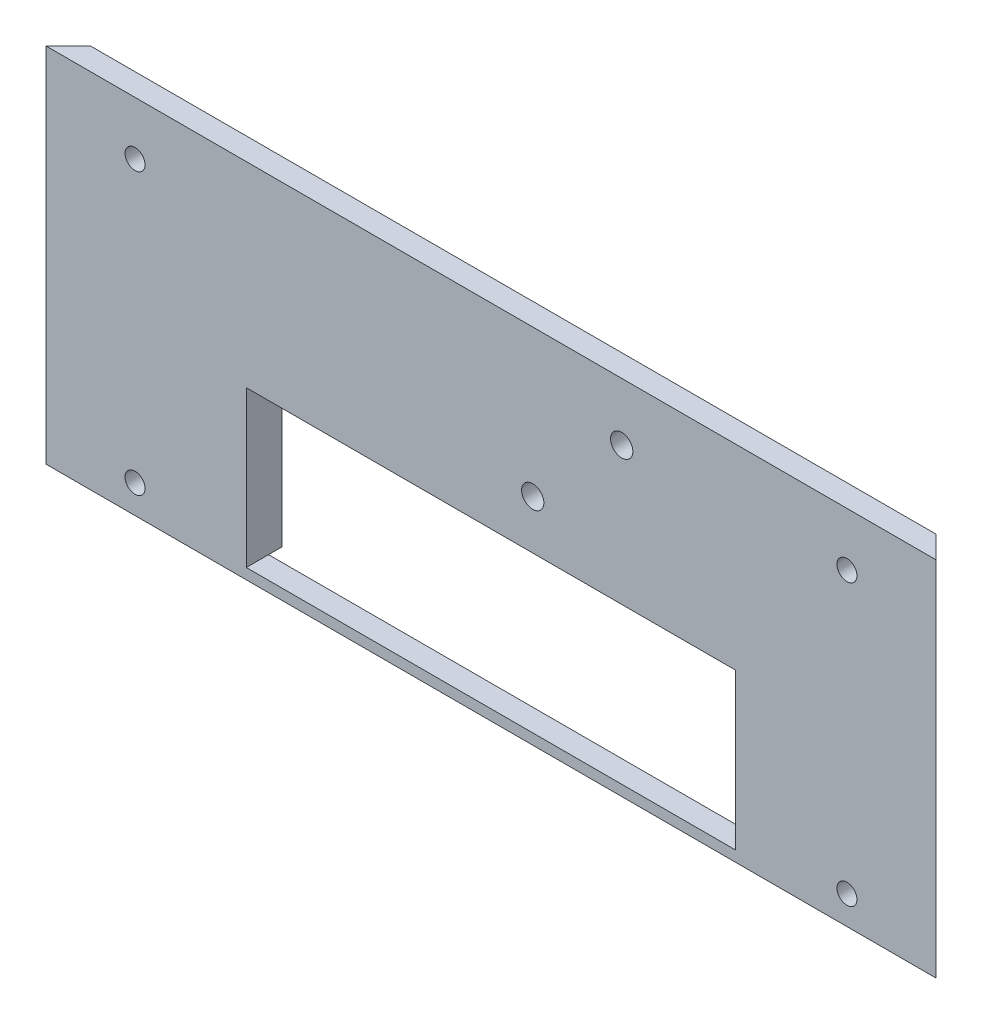
ISO-10303-21;
HEADER;
FILE_DESCRIPTION(('STEP AP214'),'2;1');
FILE_NAME('part.step','',(''),(''),'','','');
FILE_SCHEMA(('AUTOMOTIVE_DESIGN { 1 0 10303 214 1 1 1 1 }'));
ENDSEC;
DATA;
#1=APPLICATION_CONTEXT('core data for automotive mechanical design processes');
#2=APPLICATION_PROTOCOL_DEFINITION('international standard','automotive_design',2000,#1);
#3=PRODUCT_CONTEXT('',#1,'mechanical');
#4=PRODUCT('Part','Part','',(#3));
#5=PRODUCT_RELATED_PRODUCT_CATEGORY('part','',(#4));
#6=PRODUCT_DEFINITION_FORMATION('','',#4);
#7=PRODUCT_DEFINITION_CONTEXT('part definition',#1,'design');
#8=PRODUCT_DEFINITION('design','',#6,#7);
#9=PRODUCT_DEFINITION_SHAPE('','',#8);
#10=(LENGTH_UNIT() NAMED_UNIT(*) SI_UNIT(.MILLI.,.METRE.));
#11=(NAMED_UNIT(*) PLANE_ANGLE_UNIT() SI_UNIT($,.RADIAN.));
#12=(NAMED_UNIT(*) SI_UNIT($,.STERADIAN.) SOLID_ANGLE_UNIT());
#13=UNCERTAINTY_MEASURE_WITH_UNIT(LENGTH_MEASURE(1.E-05),#10,'distance_accuracy_value','');
#14=(GEOMETRIC_REPRESENTATION_CONTEXT(3) GLOBAL_UNCERTAINTY_ASSIGNED_CONTEXT((#13)) GLOBAL_UNIT_ASSIGNED_CONTEXT((#10,
#11,#12)) REPRESENTATION_CONTEXT('',''));
#15=CARTESIAN_POINT('',(0.,0.,0.));
#16=DIRECTION('',(0.,0.,1.));
#17=DIRECTION('',(1.,0.,0.));
#18=AXIS2_PLACEMENT_3D('',#15,#16,#17);
#19=CARTESIAN_POINT('',(0.,5.,-8.));
#20=DIRECTION('',(0.,1.,0.));
#21=DIRECTION('',(-1.,0.,0.));
#22=AXIS2_PLACEMENT_3D('',#19,#20,#21);
#23=PLANE('',#22);
#24=DIRECTION('',(-1.,0.,0.));
#25=VECTOR('',#24,1.);
#26=CARTESIAN_POINT('',(0.,5.,-8.));
#27=LINE('',#26,#25);
#28=CARTESIAN_POINT('',(45.,4.99999999999997,-8.));
#29=VERTEX_POINT('',#28);
#30=CARTESIAN_POINT('',(8.00000000000001,5.,-8.));
#31=VERTEX_POINT('',#30);
#32=EDGE_CURVE('E211',#29,#31,#27,.T.);
#33=ORIENTED_EDGE('',*,*,#32,.F.);
#34=DIRECTION('',(0.,0.,-1.));
#35=VECTOR('',#34,1.);
#36=CARTESIAN_POINT('',(45.,4.99999999999997,3.33066907387547E-13));
#37=LINE('',#36,#35);
#38=CARTESIAN_POINT('',(45.,4.99999999999997,-5.));
#39=VERTEX_POINT('',#38);
#40=EDGE_CURVE('E161',#39,#29,#37,.T.);
#41=ORIENTED_EDGE('',*,*,#40,.F.);
#42=DIRECTION('',(-1.,0.,0.));
#43=VECTOR('',#42,1.);
#44=CARTESIAN_POINT('',(0.,5.,-5.));
#45=LINE('',#44,#43);
#46=CARTESIAN_POINT('',(5.00000000000002,5.,-5.));
#47=VERTEX_POINT('',#46);
#48=EDGE_CURVE('E205',#39,#47,#45,.T.);
#49=ORIENTED_EDGE('',*,*,#48,.T.);
#50=DIRECTION('',(0.707106781186546,0.,-0.707106781186549));
#51=VECTOR('',#50,1.);
#52=CARTESIAN_POINT('',(8.00000000000001,5.,-8.));
#53=LINE('',#52,#51);
#54=EDGE_CURVE('E257',#47,#31,#53,.T.);
#55=ORIENTED_EDGE('',*,*,#54,.T.);
#56=EDGE_LOOP('',(#33,#41,#49,#55));
#57=FACE_BOUND('',#56,.T.);
#58=ADVANCED_FACE('F40',(#57),#23,.F.);
#59=CARTESIAN_POINT('',(0.,84.,-5.));
#60=DIRECTION('',(0.,1.,0.));
#61=DIRECTION('',(0.,0.,1.));
#62=AXIS2_PLACEMENT_3D('',#59,#60,#61);
#63=PLANE('',#62);
#64=DIRECTION('',(-0.707106781186546,0.,-0.707106781186549));
#65=VECTOR('',#64,1.);
#66=CARTESIAN_POINT('',(97.5000000000003,84.,-102.5));
#67=LINE('',#66,#65);
#68=CARTESIAN_POINT('',(200.,84.,0.));
#69=VERTEX_POINT('',#68);
#70=CARTESIAN_POINT('',(195.,84.,-4.99999999999998));
#71=VERTEX_POINT('',#70);
#72=EDGE_CURVE('E275',#69,#71,#67,.T.);
#73=ORIENTED_EDGE('',*,*,#72,.T.);
#74=DIRECTION('',(-1.,0.,0.));
#75=VECTOR('',#74,1.);
#76=CARTESIAN_POINT('',(8.00000000000001,84.,-5.));
#77=LINE('',#76,#75);
#78=CARTESIAN_POINT('',(5.00000000000002,84.,-5.));
#79=VERTEX_POINT('',#78);
#80=EDGE_CURVE('E286',#71,#79,#77,.T.);
#81=ORIENTED_EDGE('',*,*,#80,.T.);
#82=DIRECTION('',(-0.707106781186546,0.,0.707106781186549));
#83=VECTOR('',#82,1.);
#84=CARTESIAN_POINT('',(2.50000000000002,84.,-2.49999999999999));
#85=LINE('',#84,#83);
#86=CARTESIAN_POINT('',(0.,84.,0.));
#87=VERTEX_POINT('',#86);
#88=EDGE_CURVE('E272',#79,#87,#85,.T.);
#89=ORIENTED_EDGE('',*,*,#88,.T.);
#90=DIRECTION('',(-1.,0.,0.));
#91=VECTOR('',#90,1.);
#92=CARTESIAN_POINT('',(0.,84.,0.));
#93=LINE('',#92,#91);
#94=EDGE_CURVE('E246',#69,#87,#93,.T.);
#95=ORIENTED_EDGE('',*,*,#94,.F.);
#96=EDGE_LOOP('',(#73,#81,#89,#95));
#97=FACE_BOUND('',#96,.T.);
#98=ADVANCED_FACE('F351',(#97),#63,.T.);
#99=CARTESIAN_POINT('',(0.,0.,-5.));
#100=DIRECTION('',(0.,0.,-1.));
#101=DIRECTION('',(-1.,0.,0.));
#102=AXIS2_PLACEMENT_3D('',#99,#100,#101);
#103=PLANE('',#102);
#104=DIRECTION('',(1.,0.,0.));
#105=VECTOR('',#104,1.);
#106=CARTESIAN_POINT('',(-5.,2.59999999999993,-4.99999999999971));
#107=LINE('',#106,#105);
#108=CARTESIAN_POINT('',(4.99999999999973,2.59999999999993,-4.99999999999971));
#109=VERTEX_POINT('',#108);
#110=CARTESIAN_POINT('',(195.,2.59999999999993,-4.99999999999971));
#111=VERTEX_POINT('',#110);
#112=EDGE_CURVE('E182',#109,#111,#107,.T.);
#113=ORIENTED_EDGE('',*,*,#112,.F.);
#114=DIRECTION('',(0.,1.,0.));
#115=VECTOR('',#114,1.);
#116=CARTESIAN_POINT('',(5.00000000000002,0.,-5.));
#117=LINE('',#116,#115);
#118=EDGE_CURVE('E264',#109,#47,#117,.T.);
#119=ORIENTED_EDGE('',*,*,#118,.T.);
#120=ORIENTED_EDGE('',*,*,#48,.F.);
#121=DIRECTION('',(-1.,0.,0.));
#122=VECTOR('',#121,1.);
#123=CARTESIAN_POINT('',(0.,4.99999999999997,-5.));
#124=LINE('',#123,#122);
#125=CARTESIAN_POINT('',(155.,4.99999999999995,-5.));
#126=VERTEX_POINT('',#125);
#127=EDGE_CURVE('E160',#126,#39,#124,.T.);
#128=ORIENTED_EDGE('',*,*,#127,.F.);
#129=CARTESIAN_POINT('',(195.,4.99999999999996,-5.));
#130=VERTEX_POINT('',#129);
#131=EDGE_CURVE('E212',#130,#126,#45,.T.);
#132=ORIENTED_EDGE('',*,*,#131,.F.);
#133=DIRECTION('',(0.,-1.,0.));
#134=VECTOR('',#133,1.);
#135=CARTESIAN_POINT('',(195.,0.,-5.));
#136=LINE('',#135,#134);
#137=EDGE_CURVE('E268',#130,#111,#136,.T.);
#138=ORIENTED_EDGE('',*,*,#137,.T.);
#139=EDGE_LOOP('',(#113,#119,#120,#128,#132,#138));
#140=FACE_BOUND('',#139,.T.);
#141=ADVANCED_FACE('F338',(#140),#103,.T.);
#142=CARTESIAN_POINT('',(0.,0.,0.));
#143=DIRECTION('',(0.,0.,-1.));
#144=DIRECTION('',(-1.,0.,0.));
#145=AXIS2_PLACEMENT_3D('',#142,#143,#144);
#146=PLANE('',#145);
#147=DIRECTION('',(-1.,0.,0.));
#148=VECTOR('',#147,1.);
#149=CARTESIAN_POINT('',(45.,4.99999999999997,3.33066907387547E-13));
#150=LINE('',#149,#148);
#151=CARTESIAN_POINT('',(155.,4.99999999999995,3.33066907387547E-13));
#152=VERTEX_POINT('',#151);
#153=CARTESIAN_POINT('',(45.,4.99999999999997,3.33066907387547E-13));
#154=VERTEX_POINT('',#153);
#155=EDGE_CURVE('E139',#152,#154,#150,.T.);
#156=ORIENTED_EDGE('',*,*,#155,.T.);
#157=DIRECTION('',(0.,1.,0.));
#158=VECTOR('',#157,1.);
#159=CARTESIAN_POINT('',(45.,4.99999999999997,3.33066907387547E-13));
#160=LINE('',#159,#158);
#161=CARTESIAN_POINT('',(45.,40.,3.33066907387547E-13));
#162=VERTEX_POINT('',#161);
#163=EDGE_CURVE('E134',#154,#162,#160,.T.);
#164=ORIENTED_EDGE('',*,*,#163,.T.);
#165=DIRECTION('',(1.,0.,0.));
#166=VECTOR('',#165,1.);
#167=CARTESIAN_POINT('',(45.,40.,3.33066907387547E-13));
#168=LINE('',#167,#166);
#169=CARTESIAN_POINT('',(155.,40.,0.));
#170=VERTEX_POINT('',#169);
#171=EDGE_CURVE('E142',#162,#170,#168,.T.);
#172=ORIENTED_EDGE('',*,*,#171,.T.);
#173=DIRECTION('',(0.,-1.,0.));
#174=VECTOR('',#173,1.);
#175=CARTESIAN_POINT('',(155.,4.99999999999995,3.33066907387547E-13));
#176=LINE('',#175,#174);
#177=EDGE_CURVE('E57',#170,#152,#176,.T.);
#178=ORIENTED_EDGE('',*,*,#177,.T.);
#179=EDGE_LOOP('',(#156,#164,#172,#178));
#180=FACE_BOUND('',#179,.T.);
#181=CARTESIAN_POINT('',(129.377508283547,71.,0.));
#182=DIRECTION('',(0.,0.,1.));
#183=DIRECTION('',(1.,0.,0.));
#184=AXIS2_PLACEMENT_3D('',#181,#182,#183);
#185=CIRCLE('',#184,2.5);
#186=CARTESIAN_POINT('',(131.877508283547,71.,0.));
#187=VERTEX_POINT('',#186);
#188=EDGE_CURVE('E210',#187,#187,#185,.T.);
#189=ORIENTED_EDGE('',*,*,#188,.F.);
#190=EDGE_LOOP('',(#189));
#191=FACE_BOUND('',#190,.T.);
#192=CARTESIAN_POINT('',(109.377508283547,51.,0.));
#193=DIRECTION('',(0.,0.,1.));
#194=DIRECTION('',(1.,0.,0.));
#195=AXIS2_PLACEMENT_3D('',#192,#193,#194);
#196=CIRCLE('',#195,2.5);
#197=CARTESIAN_POINT('',(111.877508283547,51.,0.));
#198=VERTEX_POINT('',#197);
#199=EDGE_CURVE('E219',#198,#198,#196,.T.);
#200=ORIENTED_EDGE('',*,*,#199,.F.);
#201=EDGE_LOOP('',(#200));
#202=FACE_BOUND('',#201,.T.);
#203=CARTESIAN_POINT('',(180.,72.,0.));
#204=DIRECTION('',(0.,0.,1.));
#205=DIRECTION('',(-1.,0.,0.));
#206=AXIS2_PLACEMENT_3D('',#203,#204,#205);
#207=CIRCLE('',#206,2.25000000000001);
#208=CARTESIAN_POINT('',(177.75,72.,0.));
#209=VERTEX_POINT('',#208);
#210=EDGE_CURVE('E223',#209,#209,#207,.T.);
#211=ORIENTED_EDGE('',*,*,#210,.F.);
#212=EDGE_LOOP('',(#211));
#213=FACE_BOUND('',#212,.T.);
#214=CARTESIAN_POINT('',(20.,72.,0.));
#215=DIRECTION('',(0.,0.,1.));
#216=DIRECTION('',(1.,0.,0.));
#217=AXIS2_PLACEMENT_3D('',#214,#215,#216);
#218=CIRCLE('',#217,2.25);
#219=CARTESIAN_POINT('',(22.25,72.,0.));
#220=VERTEX_POINT('',#219);
#221=EDGE_CURVE('E227',#220,#220,#218,.T.);
#222=ORIENTED_EDGE('',*,*,#221,.F.);
#223=EDGE_LOOP('',(#222));
#224=FACE_BOUND('',#223,.T.);
#225=CARTESIAN_POINT('',(180.,9.,0.));
#226=DIRECTION('',(0.,0.,1.));
#227=DIRECTION('',(-1.,0.,0.));
#228=AXIS2_PLACEMENT_3D('',#225,#226,#227);
#229=CIRCLE('',#228,2.25000000000001);
#230=CARTESIAN_POINT('',(177.75,9.,0.));
#231=VERTEX_POINT('',#230);
#232=EDGE_CURVE('E231',#231,#231,#229,.T.);
#233=ORIENTED_EDGE('',*,*,#232,.F.);
#234=EDGE_LOOP('',(#233));
#235=FACE_BOUND('',#234,.T.);
#236=CARTESIAN_POINT('',(20.,9.,0.));
#237=DIRECTION('',(0.,0.,1.));
#238=DIRECTION('',(1.,0.,0.));
#239=AXIS2_PLACEMENT_3D('',#236,#237,#238);
#240=CIRCLE('',#239,2.25);
#241=CARTESIAN_POINT('',(22.25,9.,0.));
#242=VERTEX_POINT('',#241);
#243=EDGE_CURVE('E235',#242,#242,#240,.T.);
#244=ORIENTED_EDGE('',*,*,#243,.F.);
#245=EDGE_LOOP('',(#244));
#246=FACE_BOUND('',#245,.T.);
#247=DIRECTION('',(0.,-1.,0.));
#248=VECTOR('',#247,1.);
#249=CARTESIAN_POINT('',(0.,0.,0.));
#250=LINE('',#249,#248);
#251=CARTESIAN_POINT('',(0.,2.59999999999993,0.));
#252=VERTEX_POINT('',#251);
#253=EDGE_CURVE('E239',#87,#252,#250,.T.);
#254=ORIENTED_EDGE('',*,*,#253,.T.);
#255=DIRECTION('',(1.,0.,0.));
#256=VECTOR('',#255,1.);
#257=CARTESIAN_POINT('',(0.,2.59999999999993,3.33066907387547E-13));
#258=LINE('',#257,#256);
#259=CARTESIAN_POINT('',(200.,2.59999999999993,3.33066907387547E-13));
#260=VERTEX_POINT('',#259);
#261=EDGE_CURVE('E183',#252,#260,#258,.T.);
#262=ORIENTED_EDGE('',*,*,#261,.T.);
#263=DIRECTION('',(0.,1.,0.));
#264=VECTOR('',#263,1.);
#265=CARTESIAN_POINT('',(200.,0.,0.));
#266=LINE('',#265,#264);
#267=EDGE_CURVE('E243',#260,#69,#266,.T.);
#268=ORIENTED_EDGE('',*,*,#267,.T.);
#269=ORIENTED_EDGE('',*,*,#94,.T.);
#270=EDGE_LOOP('',(#254,#262,#268,#269));
#271=FACE_BOUND('',#270,.T.);
#272=ADVANCED_FACE('F147',(#180,#191,#202,#213,#224,#235,#246,#271),#146,.F.);
#273=CARTESIAN_POINT('',(20.,9.,-5.));
#274=DIRECTION('',(0.,0.,1.));
#275=DIRECTION('',(1.,0.,0.));
#276=AXIS2_PLACEMENT_3D('',#273,#274,#275);
#277=CYLINDRICAL_SURFACE('',#276,2.25);
#278=ORIENTED_EDGE('',*,*,#243,.T.);
#279=EDGE_LOOP('',(#278));
#280=FACE_BOUND('',#279,.T.);
#281=CARTESIAN_POINT('',(20.,9.,-8.));
#282=DIRECTION('',(0.,0.,-1.));
#283=DIRECTION('',(-1.,0.,0.));
#284=AXIS2_PLACEMENT_3D('',#281,#282,#283);
#285=CIRCLE('',#284,2.25);
#286=CARTESIAN_POINT('',(17.75,9.,-8.));
#287=VERTEX_POINT('',#286);
#288=EDGE_CURVE('E197',#287,#287,#285,.T.);
#289=ORIENTED_EDGE('',*,*,#288,.T.);
#290=EDGE_LOOP('',(#289));
#291=FACE_BOUND('',#290,.T.);
#292=ADVANCED_FACE('F387',(#280,#291),#277,.F.);
#293=CARTESIAN_POINT('',(180.,9.,-5.));
#294=DIRECTION('',(0.,0.,1.));
#295=DIRECTION('',(1.,0.,0.));
#296=AXIS2_PLACEMENT_3D('',#293,#294,#295);
#297=CYLINDRICAL_SURFACE('',#296,2.25000000000001);
#298=ORIENTED_EDGE('',*,*,#232,.T.);
#299=EDGE_LOOP('',(#298));
#300=FACE_BOUND('',#299,.T.);
#301=CARTESIAN_POINT('',(180.,9.,-8.));
#302=DIRECTION('',(0.,0.,-1.));
#303=DIRECTION('',(-1.,0.,0.));
#304=AXIS2_PLACEMENT_3D('',#301,#302,#303);
#305=CIRCLE('',#304,2.25000000000001);
#306=CARTESIAN_POINT('',(177.75,9.,-8.));
#307=VERTEX_POINT('',#306);
#308=EDGE_CURVE('E193',#307,#307,#305,.T.);
#309=ORIENTED_EDGE('',*,*,#308,.T.);
#310=EDGE_LOOP('',(#309));
#311=FACE_BOUND('',#310,.T.);
#312=ADVANCED_FACE('F383',(#300,#311),#297,.F.);
#313=CARTESIAN_POINT('',(20.,72.,-5.));
#314=DIRECTION('',(0.,0.,1.));
#315=DIRECTION('',(1.,0.,0.));
#316=AXIS2_PLACEMENT_3D('',#313,#314,#315);
#317=CYLINDRICAL_SURFACE('',#316,2.25);
#318=ORIENTED_EDGE('',*,*,#221,.T.);
#319=EDGE_LOOP('',(#318));
#320=FACE_BOUND('',#319,.T.);
#321=CARTESIAN_POINT('',(20.,72.,-8.));
#322=DIRECTION('',(0.,0.,-1.));
#323=DIRECTION('',(-1.,0.,0.));
#324=AXIS2_PLACEMENT_3D('',#321,#322,#323);
#325=CIRCLE('',#324,2.25000000000001);
#326=CARTESIAN_POINT('',(17.75,72.,-8.));
#327=VERTEX_POINT('',#326);
#328=EDGE_CURVE('E201',#327,#327,#325,.T.);
#329=ORIENTED_EDGE('',*,*,#328,.T.);
#330=EDGE_LOOP('',(#329));
#331=FACE_BOUND('',#330,.T.);
#332=ADVANCED_FACE('F379',(#320,#331),#317,.F.);
#333=CARTESIAN_POINT('',(180.,72.,-5.));
#334=DIRECTION('',(0.,0.,1.));
#335=DIRECTION('',(1.,0.,0.));
#336=AXIS2_PLACEMENT_3D('',#333,#334,#335);
#337=CYLINDRICAL_SURFACE('',#336,2.25000000000001);
#338=ORIENTED_EDGE('',*,*,#210,.T.);
#339=EDGE_LOOP('',(#338));
#340=FACE_BOUND('',#339,.T.);
#341=CARTESIAN_POINT('',(180.,72.,-8.));
#342=DIRECTION('',(0.,0.,-1.));
#343=DIRECTION('',(-1.,0.,0.));
#344=AXIS2_PLACEMENT_3D('',#341,#342,#343);
#345=CIRCLE('',#344,2.25000000000001);
#346=CARTESIAN_POINT('',(177.75,72.,-8.));
#347=VERTEX_POINT('',#346);
#348=EDGE_CURVE('E187',#347,#347,#345,.T.);
#349=ORIENTED_EDGE('',*,*,#348,.T.);
#350=EDGE_LOOP('',(#349));
#351=FACE_BOUND('',#350,.T.);
#352=ADVANCED_FACE('F372',(#340,#351),#337,.F.);
#353=CARTESIAN_POINT('',(109.377508283547,51.,-5.));
#354=DIRECTION('',(0.,0.,1.));
#355=DIRECTION('',(1.,0.,0.));
#356=AXIS2_PLACEMENT_3D('',#353,#354,#355);
#357=CYLINDRICAL_SURFACE('',#356,2.5);
#358=ORIENTED_EDGE('',*,*,#199,.T.);
#359=EDGE_LOOP('',(#358));
#360=FACE_BOUND('',#359,.T.);
#361=CARTESIAN_POINT('',(109.377508283547,51.,-8.));
#362=DIRECTION('',(0.,0.,1.));
#363=DIRECTION('',(1.,0.,0.));
#364=AXIS2_PLACEMENT_3D('',#361,#362,#363);
#365=CIRCLE('',#364,2.5);
#366=CARTESIAN_POINT('',(111.877508283547,51.,-8.));
#367=VERTEX_POINT('',#366);
#368=EDGE_CURVE('E171',#367,#367,#365,.T.);
#369=ORIENTED_EDGE('',*,*,#368,.F.);
#370=EDGE_LOOP('',(#369));
#371=FACE_BOUND('',#370,.T.);
#372=ADVANCED_FACE('F367',(#360,#371),#357,.F.);
#373=CARTESIAN_POINT('',(129.377508283547,71.,-5.));
#374=DIRECTION('',(0.,0.,1.));
#375=DIRECTION('',(1.,0.,0.));
#376=AXIS2_PLACEMENT_3D('',#373,#374,#375);
#377=CYLINDRICAL_SURFACE('',#376,2.5);
#378=ORIENTED_EDGE('',*,*,#188,.T.);
#379=EDGE_LOOP('',(#378));
#380=FACE_BOUND('',#379,.T.);
#381=CARTESIAN_POINT('',(129.377508283547,71.,-8.));
#382=DIRECTION('',(0.,0.,1.));
#383=DIRECTION('',(1.,0.,0.));
#384=AXIS2_PLACEMENT_3D('',#381,#382,#383);
#385=CIRCLE('',#384,2.5);
#386=CARTESIAN_POINT('',(131.877508283547,71.,-8.));
#387=VERTEX_POINT('',#386);
#388=EDGE_CURVE('E172',#387,#387,#385,.T.);
#389=ORIENTED_EDGE('',*,*,#388,.F.);
#390=EDGE_LOOP('',(#389));
#391=FACE_BOUND('',#390,.T.);
#392=ADVANCED_FACE('F361',(#380,#391),#377,.F.);
#393=ORIENTED_EDGE('',*,*,#131,.T.);
#394=DIRECTION('',(0.,0.,-1.));
#395=VECTOR('',#394,1.);
#396=CARTESIAN_POINT('',(155.,4.99999999999995,3.33066907387547E-13));
#397=LINE('',#396,#395);
#398=CARTESIAN_POINT('',(155.,4.99999999999995,-8.));
#399=VERTEX_POINT('',#398);
#400=EDGE_CURVE('E166',#126,#399,#397,.T.);
#401=ORIENTED_EDGE('',*,*,#400,.T.);
#402=CARTESIAN_POINT('',(192.,4.99999999999997,-8.));
#403=VERTEX_POINT('',#402);
#404=EDGE_CURVE('E206',#403,#399,#27,.T.);
#405=ORIENTED_EDGE('',*,*,#404,.F.);
#406=DIRECTION('',(0.707106781186546,0.,0.707106781186549));
#407=VECTOR('',#406,1.);
#408=CARTESIAN_POINT('',(192.,4.99999999999997,-8.));
#409=LINE('',#408,#407);
#410=EDGE_CURVE('E261',#403,#130,#409,.T.);
#411=ORIENTED_EDGE('',*,*,#410,.T.);
#412=EDGE_LOOP('',(#393,#401,#405,#411));
#413=FACE_BOUND('',#412,.T.);
#414=ADVANCED_FACE('F306',(#413),#23,.F.);
#415=CARTESIAN_POINT('',(0.,0.,-8.));
#416=DIRECTION('',(0.,0.,1.));
#417=DIRECTION('',(1.,0.,0.));
#418=AXIS2_PLACEMENT_3D('',#415,#416,#417);
#419=PLANE('',#418);
#420=ORIENTED_EDGE('',*,*,#388,.T.);
#421=EDGE_LOOP('',(#420));
#422=FACE_BOUND('',#421,.T.);
#423=ORIENTED_EDGE('',*,*,#368,.T.);
#424=EDGE_LOOP('',(#423));
#425=FACE_BOUND('',#424,.T.);
#426=DIRECTION('',(-1.,0.,0.));
#427=VECTOR('',#426,1.);
#428=CARTESIAN_POINT('',(0.,40.,-8.));
#429=LINE('',#428,#427);
#430=CARTESIAN_POINT('',(155.,40.,-8.));
#431=VERTEX_POINT('',#430);
#432=CARTESIAN_POINT('',(45.,40.,-8.));
#433=VERTEX_POINT('',#432);
#434=EDGE_CURVE('E295',#431,#433,#429,.T.);
#435=ORIENTED_EDGE('',*,*,#434,.T.);
#436=DIRECTION('',(0.,-1.,0.));
#437=VECTOR('',#436,1.);
#438=CARTESIAN_POINT('',(45.,0.,-8.));
#439=LINE('',#438,#437);
#440=EDGE_CURVE('E11',#433,#29,#439,.T.);
#441=ORIENTED_EDGE('',*,*,#440,.T.);
#442=ORIENTED_EDGE('',*,*,#32,.T.);
#443=DIRECTION('',(0.,1.,0.));
#444=VECTOR('',#443,1.);
#445=CARTESIAN_POINT('',(8.00000000000001,84.,-8.));
#446=LINE('',#445,#444);
#447=CARTESIAN_POINT('',(8.00000000000001,81.,-8.));
#448=VERTEX_POINT('',#447);
#449=EDGE_CURVE('E250',#31,#448,#446,.T.);
#450=ORIENTED_EDGE('',*,*,#449,.T.);
#451=DIRECTION('',(1.,0.,0.));
#452=VECTOR('',#451,1.);
#453=CARTESIAN_POINT('',(192.,81.,-8.));
#454=LINE('',#453,#452);
#455=CARTESIAN_POINT('',(192.,81.,-8.));
#456=VERTEX_POINT('',#455);
#457=EDGE_CURVE('E279',#448,#456,#454,.T.);
#458=ORIENTED_EDGE('',*,*,#457,.T.);
#459=DIRECTION('',(0.,-1.,0.));
#460=VECTOR('',#459,1.);
#461=CARTESIAN_POINT('',(192.,4.99999999999996,-8.));
#462=LINE('',#461,#460);
#463=EDGE_CURVE('E254',#456,#403,#462,.T.);
#464=ORIENTED_EDGE('',*,*,#463,.T.);
#465=ORIENTED_EDGE('',*,*,#404,.T.);
#466=DIRECTION('',(0.,1.,0.));
#467=VECTOR('',#466,1.);
#468=CARTESIAN_POINT('',(155.,0.,-8.));
#469=LINE('',#468,#467);
#470=EDGE_CURVE('E50',#399,#431,#469,.T.);
#471=ORIENTED_EDGE('',*,*,#470,.T.);
#472=EDGE_LOOP('',(#435,#441,#442,#450,#458,#464,#465,#471));
#473=FACE_BOUND('',#472,.T.);
#474=ORIENTED_EDGE('',*,*,#328,.F.);
#475=EDGE_LOOP('',(#474));
#476=FACE_BOUND('',#475,.T.);
#477=ORIENTED_EDGE('',*,*,#288,.F.);
#478=EDGE_LOOP('',(#477));
#479=FACE_BOUND('',#478,.T.);
#480=ORIENTED_EDGE('',*,*,#308,.F.);
#481=EDGE_LOOP('',(#480));
#482=FACE_BOUND('',#481,.T.);
#483=ORIENTED_EDGE('',*,*,#348,.F.);
#484=EDGE_LOOP('',(#483));
#485=FACE_BOUND('',#484,.T.);
#486=ADVANCED_FACE('F300',(#422,#425,#473,#476,#479,#482,#485),#419,.F.);
#487=CARTESIAN_POINT('',(192.,0.,-8.));
#488=DIRECTION('',(0.707106781186549,0.,-0.707106781186546));
#489=DIRECTION('',(0.,1.,0.));
#490=AXIS2_PLACEMENT_3D('',#487,#488,#489);
#491=PLANE('',#490);
#492=DIRECTION('',(0.707106781186544,0.,0.70710678118655));
#493=VECTOR('',#492,1.);
#494=CARTESIAN_POINT('',(200.,2.59999999999993,3.33066907387547E-13));
#495=LINE('',#494,#493);
#496=EDGE_CURVE('E176',#111,#260,#495,.T.);
#497=ORIENTED_EDGE('',*,*,#496,.F.);
#498=ORIENTED_EDGE('',*,*,#137,.F.);
#499=ORIENTED_EDGE('',*,*,#410,.F.);
#500=ORIENTED_EDGE('',*,*,#463,.F.);
#501=DIRECTION('',(0.577350269189624,0.577350269189627,0.577350269189626));
#502=VECTOR('',#501,1.);
#503=CARTESIAN_POINT('',(165.,53.9999999999999,-35.0000000000001));
#504=LINE('',#503,#502);
#505=EDGE_CURVE('E283',#456,#71,#504,.T.);
#506=ORIENTED_EDGE('',*,*,#505,.T.);
#507=ORIENTED_EDGE('',*,*,#72,.F.);
#508=ORIENTED_EDGE('',*,*,#267,.F.);
#509=EDGE_LOOP('',(#497,#498,#499,#500,#506,#507,#508));
#510=FACE_BOUND('',#509,.T.);
#511=ADVANCED_FACE('F332',(#510),#491,.T.);
#512=CARTESIAN_POINT('',(8.00000000000001,0.,-8.));
#513=DIRECTION('',(-0.707106781186549,0.,-0.707106781186546));
#514=DIRECTION('',(0.,-1.,0.));
#515=AXIS2_PLACEMENT_3D('',#512,#513,#514);
#516=PLANE('',#515);
#517=DIRECTION('',(0.707106781186546,0.,-0.707106781186549));
#518=VECTOR('',#517,1.);
#519=CARTESIAN_POINT('',(8.00000000000001,2.59999999999993,-8.));
#520=LINE('',#519,#518);
#521=EDGE_CURVE('E292',#252,#109,#520,.T.);
#522=ORIENTED_EDGE('',*,*,#521,.F.);
#523=ORIENTED_EDGE('',*,*,#253,.F.);
#524=ORIENTED_EDGE('',*,*,#88,.F.);
#525=DIRECTION('',(0.577350269189624,-0.577350269189627,-0.577350269189626));
#526=VECTOR('',#525,1.);
#527=CARTESIAN_POINT('',(35.,53.9999999999999,-35.0000000000001));
#528=LINE('',#527,#526);
#529=EDGE_CURVE('E289',#79,#448,#528,.T.);
#530=ORIENTED_EDGE('',*,*,#529,.T.);
#531=ORIENTED_EDGE('',*,*,#449,.F.);
#532=ORIENTED_EDGE('',*,*,#54,.F.);
#533=ORIENTED_EDGE('',*,*,#118,.F.);
#534=EDGE_LOOP('',(#522,#523,#524,#530,#531,#532,#533));
#535=FACE_BOUND('',#534,.T.);
#536=ADVANCED_FACE('F322',(#535),#516,.T.);
#537=CARTESIAN_POINT('',(0.,81.,-8.));
#538=DIRECTION('',(0.,0.707106781186547,-0.707106781186548));
#539=DIRECTION('',(-1.,0.,0.));
#540=AXIS2_PLACEMENT_3D('',#537,#538,#539);
#541=PLANE('',#540);
#542=ORIENTED_EDGE('',*,*,#529,.F.);
#543=ORIENTED_EDGE('',*,*,#80,.F.);
#544=ORIENTED_EDGE('',*,*,#505,.F.);
#545=ORIENTED_EDGE('',*,*,#457,.F.);
#546=EDGE_LOOP('',(#542,#543,#544,#545));
#547=FACE_BOUND('',#546,.T.);
#548=ADVANCED_FACE('F43',(#547),#541,.T.);
#549=CARTESIAN_POINT('',(0.,2.59999999999993,3.33066907387547E-13));
#550=DIRECTION('',(0.,1.,0.));
#551=DIRECTION('',(-1.,0.,0.));
#552=AXIS2_PLACEMENT_3D('',#549,#550,#551);
#553=PLANE('',#552);
#554=ORIENTED_EDGE('',*,*,#521,.T.);
#555=ORIENTED_EDGE('',*,*,#112,.T.);
#556=ORIENTED_EDGE('',*,*,#496,.T.);
#557=ORIENTED_EDGE('',*,*,#261,.F.);
#558=EDGE_LOOP('',(#554,#555,#556,#557));
#559=FACE_BOUND('',#558,.T.);
#560=ADVANCED_FACE('F348',(#559),#553,.F.);
#561=CARTESIAN_POINT('',(45.,4.99999999999997,3.33066907387547E-13));
#562=DIRECTION('',(-1.,0.,0.));
#563=DIRECTION('',(0.,0.,1.));
#564=AXIS2_PLACEMENT_3D('',#561,#562,#563);
#565=PLANE('',#564);
#566=DIRECTION('',(0.,0.,-1.));
#567=VECTOR('',#566,1.);
#568=CARTESIAN_POINT('',(45.,40.,3.33066907387547E-13));
#569=LINE('',#568,#567);
#570=EDGE_CURVE('E65',#162,#433,#569,.T.);
#571=ORIENTED_EDGE('',*,*,#570,.F.);
#572=ORIENTED_EDGE('',*,*,#163,.F.);
#573=EDGE_CURVE('E157',#154,#39,#37,.T.);
#574=ORIENTED_EDGE('',*,*,#573,.T.);
#575=ORIENTED_EDGE('',*,*,#40,.T.);
#576=ORIENTED_EDGE('',*,*,#440,.F.);
#577=EDGE_LOOP('',(#571,#572,#574,#575,#576));
#578=FACE_BOUND('',#577,.T.);
#579=ADVANCED_FACE('F131',(#578),#565,.F.);
#580=CARTESIAN_POINT('',(45.,4.99999999999997,3.33066907387547E-13));
#581=DIRECTION('',(0.,-1.,0.));
#582=DIRECTION('',(1.,0.,0.));
#583=AXIS2_PLACEMENT_3D('',#580,#581,#582);
#584=PLANE('',#583);
#585=ORIENTED_EDGE('',*,*,#127,.T.);
#586=ORIENTED_EDGE('',*,*,#573,.F.);
#587=ORIENTED_EDGE('',*,*,#155,.F.);
#588=EDGE_CURVE('E162',#152,#126,#397,.T.);
#589=ORIENTED_EDGE('',*,*,#588,.T.);
#590=EDGE_LOOP('',(#585,#586,#587,#589));
#591=FACE_BOUND('',#590,.T.);
#592=ADVANCED_FACE('F340',(#591),#584,.F.);
#593=CARTESIAN_POINT('',(155.,4.99999999999995,3.33066907387547E-13));
#594=DIRECTION('',(1.,0.,0.));
#595=DIRECTION('',(0.,0.,-1.));
#596=AXIS2_PLACEMENT_3D('',#593,#594,#595);
#597=PLANE('',#596);
#598=ORIENTED_EDGE('',*,*,#400,.F.);
#599=ORIENTED_EDGE('',*,*,#588,.F.);
#600=ORIENTED_EDGE('',*,*,#177,.F.);
#601=DIRECTION('',(0.,0.,-1.));
#602=VECTOR('',#601,1.);
#603=CARTESIAN_POINT('',(155.,40.,3.33066907387547E-13));
#604=LINE('',#603,#602);
#605=EDGE_CURVE('E138',#170,#431,#604,.T.);
#606=ORIENTED_EDGE('',*,*,#605,.T.);
#607=ORIENTED_EDGE('',*,*,#470,.F.);
#608=EDGE_LOOP('',(#598,#599,#600,#606,#607));
#609=FACE_BOUND('',#608,.T.);
#610=ADVANCED_FACE('F304',(#609),#597,.F.);
#611=CARTESIAN_POINT('',(45.,40.,3.33066907387547E-13));
#612=DIRECTION('',(0.,1.,0.));
#613=DIRECTION('',(-1.,0.,0.));
#614=AXIS2_PLACEMENT_3D('',#611,#612,#613);
#615=PLANE('',#614);
#616=ORIENTED_EDGE('',*,*,#605,.F.);
#617=ORIENTED_EDGE('',*,*,#171,.F.);
#618=ORIENTED_EDGE('',*,*,#570,.T.);
#619=ORIENTED_EDGE('',*,*,#434,.F.);
#620=EDGE_LOOP('',(#616,#617,#618,#619));
#621=FACE_BOUND('',#620,.T.);
#622=ADVANCED_FACE('F143',(#621),#615,.F.);
#623=CLOSED_SHELL('',(#58,#98,#141,#272,#292,#312,#332,#352,#372,#392,#414,#486,#511,#536,#548,
#560,#579,#592,#610,#622));
#624=MANIFOLD_SOLID_BREP('B2',#623);
#625=ADVANCED_BREP_SHAPE_REPRESENTATION('',(#18,#624),#14);
#626=SHAPE_DEFINITION_REPRESENTATION(#9,#625);
ENDSEC;
END-ISO-10303-21;
